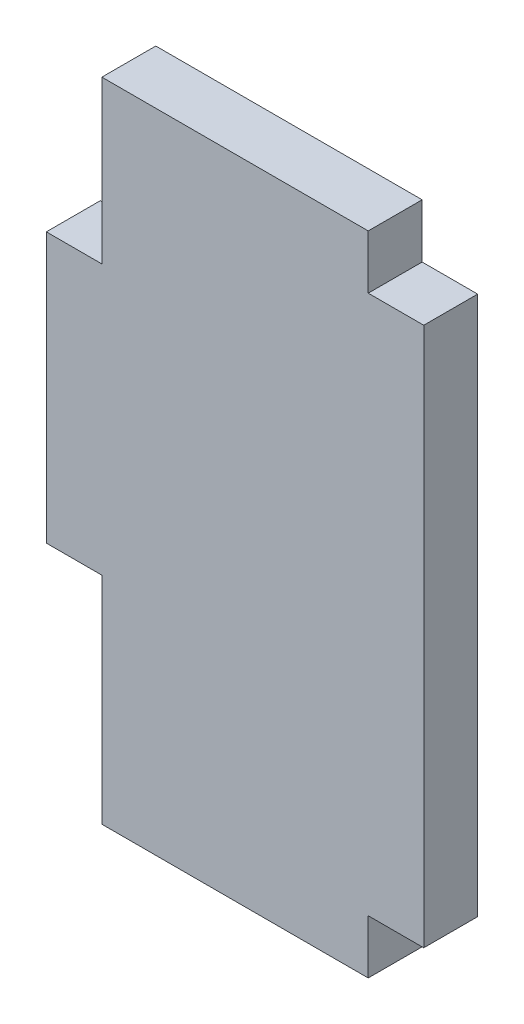
ISO-10303-21;
HEADER;
FILE_DESCRIPTION(('STEP AP214'),'2;1');
FILE_NAME('part.step','',(''),(''),'','','');
FILE_SCHEMA(('AUTOMOTIVE_DESIGN { 1 0 10303 214 1 1 1 1 }'));
ENDSEC;
DATA;
#1=APPLICATION_CONTEXT('core data for automotive mechanical design processes');
#2=APPLICATION_PROTOCOL_DEFINITION('international standard','automotive_design',2000,#1);
#3=PRODUCT_CONTEXT('',#1,'mechanical');
#4=PRODUCT('Part','Part','',(#3));
#5=PRODUCT_RELATED_PRODUCT_CATEGORY('part','',(#4));
#6=PRODUCT_DEFINITION_FORMATION('','',#4);
#7=PRODUCT_DEFINITION_CONTEXT('part definition',#1,'design');
#8=PRODUCT_DEFINITION('design','',#6,#7);
#9=PRODUCT_DEFINITION_SHAPE('','',#8);
#10=(LENGTH_UNIT() NAMED_UNIT(*) SI_UNIT(.MILLI.,.METRE.));
#11=(NAMED_UNIT(*) PLANE_ANGLE_UNIT() SI_UNIT($,.RADIAN.));
#12=(NAMED_UNIT(*) SI_UNIT($,.STERADIAN.) SOLID_ANGLE_UNIT());
#13=UNCERTAINTY_MEASURE_WITH_UNIT(LENGTH_MEASURE(1.E-05),#10,'distance_accuracy_value','');
#14=(GEOMETRIC_REPRESENTATION_CONTEXT(3) GLOBAL_UNCERTAINTY_ASSIGNED_CONTEXT((#13)) GLOBAL_UNIT_ASSIGNED_CONTEXT((#10,
#11,#12)) REPRESENTATION_CONTEXT('',''));
#15=CARTESIAN_POINT('',(0.,0.,0.));
#16=DIRECTION('',(0.,0.,1.));
#17=DIRECTION('',(1.,0.,0.));
#18=AXIS2_PLACEMENT_3D('',#15,#16,#17);
#19=CARTESIAN_POINT('',(-5.15,45.,5.));
#20=DIRECTION('',(1.,0.,0.));
#21=DIRECTION('',(0.,0.,-1.));
#22=AXIS2_PLACEMENT_3D('',#19,#20,#21);
#23=PLANE('',#22);
#24=DIRECTION('',(0.,-1.,0.));
#25=VECTOR('',#24,1.);
#26=CARTESIAN_POINT('',(-5.15,45.,0.));
#27=LINE('',#26,#25);
#28=CARTESIAN_POINT('',(-5.15,45.,0.));
#29=VERTEX_POINT('',#28);
#30=CARTESIAN_POINT('',(-5.15,20.,0.));
#31=VERTEX_POINT('',#30);
#32=EDGE_CURVE('E164',#29,#31,#27,.T.);
#33=ORIENTED_EDGE('',*,*,#32,.T.);
#34=DIRECTION('',(0.,0.,-1.));
#35=VECTOR('',#34,1.);
#36=CARTESIAN_POINT('',(-5.15,20.,5.));
#37=LINE('',#36,#35);
#38=CARTESIAN_POINT('',(-5.15,20.,5.));
#39=VERTEX_POINT('',#38);
#40=EDGE_CURVE('E11',#39,#31,#37,.T.);
#41=ORIENTED_EDGE('',*,*,#40,.F.);
#42=DIRECTION('',(0.,-1.,0.));
#43=VECTOR('',#42,1.);
#44=CARTESIAN_POINT('',(-5.15,45.,5.));
#45=LINE('',#44,#43);
#46=CARTESIAN_POINT('',(-5.15,45.,5.));
#47=VERTEX_POINT('',#46);
#48=EDGE_CURVE('E198',#47,#39,#45,.T.);
#49=ORIENTED_EDGE('',*,*,#48,.F.);
#50=DIRECTION('',(0.,0.,-1.));
#51=VECTOR('',#50,1.);
#52=CARTESIAN_POINT('',(-5.15,45.,5.));
#53=LINE('',#52,#51);
#54=EDGE_CURVE('E160',#47,#29,#53,.T.);
#55=ORIENTED_EDGE('',*,*,#54,.T.);
#56=EDGE_LOOP('',(#33,#41,#49,#55));
#57=FACE_BOUND('',#56,.T.);
#58=ADVANCED_FACE('F39',(#57),#23,.F.);
#59=CARTESIAN_POINT('',(-5.15,20.,5.));
#60=DIRECTION('',(0.,1.,0.));
#61=DIRECTION('',(0.,0.,1.));
#62=AXIS2_PLACEMENT_3D('',#59,#60,#61);
#63=PLANE('',#62);
#64=DIRECTION('',(1.,0.,0.));
#65=VECTOR('',#64,1.);
#66=CARTESIAN_POINT('',(-5.15,20.,0.));
#67=LINE('',#66,#65);
#68=CARTESIAN_POINT('',(0.,20.,0.));
#69=VERTEX_POINT('',#68);
#70=EDGE_CURVE('E168',#31,#69,#67,.T.);
#71=ORIENTED_EDGE('',*,*,#70,.T.);
#72=DIRECTION('',(0.,0.,-1.));
#73=VECTOR('',#72,1.);
#74=CARTESIAN_POINT('',(0.,20.,5.));
#75=LINE('',#74,#73);
#76=CARTESIAN_POINT('',(0.,20.,5.));
#77=VERTEX_POINT('',#76);
#78=EDGE_CURVE('E48',#77,#69,#75,.T.);
#79=ORIENTED_EDGE('',*,*,#78,.F.);
#80=DIRECTION('',(1.,0.,0.));
#81=VECTOR('',#80,1.);
#82=CARTESIAN_POINT('',(-5.15,20.,5.));
#83=LINE('',#82,#81);
#84=EDGE_CURVE('E111',#39,#77,#83,.T.);
#85=ORIENTED_EDGE('',*,*,#84,.F.);
#86=ORIENTED_EDGE('',*,*,#40,.T.);
#87=EDGE_LOOP('',(#71,#79,#85,#86));
#88=FACE_BOUND('',#87,.T.);
#89=ADVANCED_FACE('F292',(#88),#63,.F.);
#90=CARTESIAN_POINT('',(0.,20.,5.));
#91=DIRECTION('',(1.,0.,0.));
#92=DIRECTION('',(0.,0.,-1.));
#93=AXIS2_PLACEMENT_3D('',#90,#91,#92);
#94=PLANE('',#93);
#95=DIRECTION('',(0.,-1.,0.));
#96=VECTOR('',#95,1.);
#97=CARTESIAN_POINT('',(0.,20.,0.));
#98=LINE('',#97,#96);
#99=CARTESIAN_POINT('',(0.,0.,0.));
#100=VERTEX_POINT('',#99);
#101=EDGE_CURVE('E171',#69,#100,#98,.T.);
#102=ORIENTED_EDGE('',*,*,#101,.T.);
#103=DIRECTION('',(0.,0.,-1.));
#104=VECTOR('',#103,1.);
#105=CARTESIAN_POINT('',(0.,0.,5.));
#106=LINE('',#105,#104);
#107=CARTESIAN_POINT('',(0.,0.,5.));
#108=VERTEX_POINT('',#107);
#109=EDGE_CURVE('E225',#108,#100,#106,.T.);
#110=ORIENTED_EDGE('',*,*,#109,.F.);
#111=DIRECTION('',(0.,-1.,0.));
#112=VECTOR('',#111,1.);
#113=CARTESIAN_POINT('',(0.,20.,5.));
#114=LINE('',#113,#112);
#115=EDGE_CURVE('E235',#77,#108,#114,.T.);
#116=ORIENTED_EDGE('',*,*,#115,.F.);
#117=ORIENTED_EDGE('',*,*,#78,.T.);
#118=EDGE_LOOP('',(#102,#110,#116,#117));
#119=FACE_BOUND('',#118,.T.);
#120=ADVANCED_FACE('F233',(#119),#94,.F.);
#121=CARTESIAN_POINT('',(0.,0.,5.));
#122=DIRECTION('',(0.,1.,0.));
#123=DIRECTION('',(0.,0.,1.));
#124=AXIS2_PLACEMENT_3D('',#121,#122,#123);
#125=PLANE('',#124);
#126=DIRECTION('',(1.,0.,0.));
#127=VECTOR('',#126,1.);
#128=CARTESIAN_POINT('',(0.,0.,0.));
#129=LINE('',#128,#127);
#130=CARTESIAN_POINT('',(24.7,0.,0.));
#131=VERTEX_POINT('',#130);
#132=EDGE_CURVE('E174',#100,#131,#129,.T.);
#133=ORIENTED_EDGE('',*,*,#132,.T.);
#134=DIRECTION('',(0.,0.,-1.));
#135=VECTOR('',#134,1.);
#136=CARTESIAN_POINT('',(24.7,0.,5.));
#137=LINE('',#136,#135);
#138=CARTESIAN_POINT('',(24.7,0.,5.));
#139=VERTEX_POINT('',#138);
#140=EDGE_CURVE('E221',#139,#131,#137,.T.);
#141=ORIENTED_EDGE('',*,*,#140,.F.);
#142=DIRECTION('',(1.,0.,0.));
#143=VECTOR('',#142,1.);
#144=CARTESIAN_POINT('',(0.,0.,5.));
#145=LINE('',#144,#143);
#146=EDGE_CURVE('E254',#108,#139,#145,.T.);
#147=ORIENTED_EDGE('',*,*,#146,.F.);
#148=ORIENTED_EDGE('',*,*,#109,.T.);
#149=EDGE_LOOP('',(#133,#141,#147,#148));
#150=FACE_BOUND('',#149,.T.);
#151=ADVANCED_FACE('F244',(#150),#125,.F.);
#152=CARTESIAN_POINT('',(24.7,0.,5.));
#153=DIRECTION('',(-1.,0.,0.));
#154=DIRECTION('',(0.,0.,1.));
#155=AXIS2_PLACEMENT_3D('',#152,#153,#154);
#156=PLANE('',#155);
#157=DIRECTION('',(0.,1.,0.));
#158=VECTOR('',#157,1.);
#159=CARTESIAN_POINT('',(24.7,0.,0.));
#160=LINE('',#159,#158);
#161=CARTESIAN_POINT('',(24.7,5.,0.));
#162=VERTEX_POINT('',#161);
#163=EDGE_CURVE('E177',#131,#162,#160,.T.);
#164=ORIENTED_EDGE('',*,*,#163,.T.);
#165=DIRECTION('',(0.,0.,-1.));
#166=VECTOR('',#165,1.);
#167=CARTESIAN_POINT('',(24.7,5.,5.));
#168=LINE('',#167,#166);
#169=CARTESIAN_POINT('',(24.7,5.,5.));
#170=VERTEX_POINT('',#169);
#171=EDGE_CURVE('E217',#170,#162,#168,.T.);
#172=ORIENTED_EDGE('',*,*,#171,.F.);
#173=DIRECTION('',(0.,1.,0.));
#174=VECTOR('',#173,1.);
#175=CARTESIAN_POINT('',(24.7,0.,5.));
#176=LINE('',#175,#174);
#177=EDGE_CURVE('E250',#139,#170,#176,.T.);
#178=ORIENTED_EDGE('',*,*,#177,.F.);
#179=ORIENTED_EDGE('',*,*,#140,.T.);
#180=EDGE_LOOP('',(#164,#172,#178,#179));
#181=FACE_BOUND('',#180,.T.);
#182=ADVANCED_FACE('F248',(#181),#156,.F.);
#183=CARTESIAN_POINT('',(24.7,5.,5.));
#184=DIRECTION('',(0.,1.,0.));
#185=DIRECTION('',(-1.,0.,0.));
#186=AXIS2_PLACEMENT_3D('',#183,#184,#185);
#187=PLANE('',#186);
#188=DIRECTION('',(1.,0.,0.));
#189=VECTOR('',#188,1.);
#190=CARTESIAN_POINT('',(24.7,5.,0.));
#191=LINE('',#190,#189);
#192=CARTESIAN_POINT('',(29.85,5.,0.));
#193=VERTEX_POINT('',#192);
#194=EDGE_CURVE('E180',#162,#193,#191,.T.);
#195=ORIENTED_EDGE('',*,*,#194,.T.);
#196=DIRECTION('',(0.,0.,-1.));
#197=VECTOR('',#196,1.);
#198=CARTESIAN_POINT('',(29.85,5.,5.));
#199=LINE('',#198,#197);
#200=CARTESIAN_POINT('',(29.85,5.,5.));
#201=VERTEX_POINT('',#200);
#202=EDGE_CURVE('E213',#201,#193,#199,.T.);
#203=ORIENTED_EDGE('',*,*,#202,.F.);
#204=DIRECTION('',(1.,0.,0.));
#205=VECTOR('',#204,1.);
#206=CARTESIAN_POINT('',(24.7,5.,5.));
#207=LINE('',#206,#205);
#208=EDGE_CURVE('E253',#170,#201,#207,.T.);
#209=ORIENTED_EDGE('',*,*,#208,.F.);
#210=ORIENTED_EDGE('',*,*,#171,.T.);
#211=EDGE_LOOP('',(#195,#203,#209,#210));
#212=FACE_BOUND('',#211,.T.);
#213=ADVANCED_FACE('F305',(#212),#187,.F.);
#214=CARTESIAN_POINT('',(29.85,55.,5.));
#215=DIRECTION('',(-1.,0.,0.));
#216=DIRECTION('',(0.,0.,1.));
#217=AXIS2_PLACEMENT_3D('',#214,#215,#216);
#218=PLANE('',#217);
#219=DIRECTION('',(0.,1.,0.));
#220=VECTOR('',#219,1.);
#221=CARTESIAN_POINT('',(29.85,55.,0.));
#222=LINE('',#221,#220);
#223=CARTESIAN_POINT('',(29.85,55.,0.));
#224=VERTEX_POINT('',#223);
#225=EDGE_CURVE('E183',#193,#224,#222,.T.);
#226=ORIENTED_EDGE('',*,*,#225,.T.);
#227=DIRECTION('',(0.,0.,-1.));
#228=VECTOR('',#227,1.);
#229=CARTESIAN_POINT('',(29.85,55.,5.));
#230=LINE('',#229,#228);
#231=CARTESIAN_POINT('',(29.85,55.,5.));
#232=VERTEX_POINT('',#231);
#233=EDGE_CURVE('E209',#232,#224,#230,.T.);
#234=ORIENTED_EDGE('',*,*,#233,.F.);
#235=DIRECTION('',(0.,1.,0.));
#236=VECTOR('',#235,1.);
#237=CARTESIAN_POINT('',(29.85,55.,5.));
#238=LINE('',#237,#236);
#239=EDGE_CURVE('E258',#201,#232,#238,.T.);
#240=ORIENTED_EDGE('',*,*,#239,.F.);
#241=ORIENTED_EDGE('',*,*,#202,.T.);
#242=EDGE_LOOP('',(#226,#234,#240,#241));
#243=FACE_BOUND('',#242,.T.);
#244=ADVANCED_FACE('F308',(#243),#218,.F.);
#245=CARTESIAN_POINT('',(24.7,55.,5.));
#246=DIRECTION('',(0.,-1.,0.));
#247=DIRECTION('',(0.,0.,-1.));
#248=AXIS2_PLACEMENT_3D('',#245,#246,#247);
#249=PLANE('',#248);
#250=DIRECTION('',(-1.,0.,0.));
#251=VECTOR('',#250,1.);
#252=CARTESIAN_POINT('',(24.7,55.,0.));
#253=LINE('',#252,#251);
#254=CARTESIAN_POINT('',(24.7,55.,0.));
#255=VERTEX_POINT('',#254);
#256=EDGE_CURVE('E186',#224,#255,#253,.T.);
#257=ORIENTED_EDGE('',*,*,#256,.T.);
#258=DIRECTION('',(0.,0.,-1.));
#259=VECTOR('',#258,1.);
#260=CARTESIAN_POINT('',(24.7,55.,5.));
#261=LINE('',#260,#259);
#262=CARTESIAN_POINT('',(24.7,55.,5.));
#263=VERTEX_POINT('',#262);
#264=EDGE_CURVE('E205',#263,#255,#261,.T.);
#265=ORIENTED_EDGE('',*,*,#264,.F.);
#266=DIRECTION('',(-1.,0.,0.));
#267=VECTOR('',#266,1.);
#268=CARTESIAN_POINT('',(24.7,55.,5.));
#269=LINE('',#268,#267);
#270=EDGE_CURVE('E265',#232,#263,#269,.T.);
#271=ORIENTED_EDGE('',*,*,#270,.F.);
#272=ORIENTED_EDGE('',*,*,#233,.T.);
#273=EDGE_LOOP('',(#257,#265,#271,#272));
#274=FACE_BOUND('',#273,.T.);
#275=ADVANCED_FACE('F273',(#274),#249,.F.);
#276=CARTESIAN_POINT('',(24.7,60.,5.));
#277=DIRECTION('',(-1.,0.,0.));
#278=DIRECTION('',(0.,-1.,0.));
#279=AXIS2_PLACEMENT_3D('',#276,#277,#278);
#280=PLANE('',#279);
#281=DIRECTION('',(0.,1.,0.));
#282=VECTOR('',#281,1.);
#283=CARTESIAN_POINT('',(24.7,60.,0.));
#284=LINE('',#283,#282);
#285=CARTESIAN_POINT('',(24.7,60.,0.));
#286=VERTEX_POINT('',#285);
#287=EDGE_CURVE('E189',#255,#286,#284,.T.);
#288=ORIENTED_EDGE('',*,*,#287,.T.);
#289=DIRECTION('',(0.,0.,-1.));
#290=VECTOR('',#289,1.);
#291=CARTESIAN_POINT('',(24.7,60.,5.));
#292=LINE('',#291,#290);
#293=CARTESIAN_POINT('',(24.7,60.,5.));
#294=VERTEX_POINT('',#293);
#295=EDGE_CURVE('E153',#294,#286,#292,.T.);
#296=ORIENTED_EDGE('',*,*,#295,.F.);
#297=DIRECTION('',(0.,1.,0.));
#298=VECTOR('',#297,1.);
#299=CARTESIAN_POINT('',(24.7,60.,5.));
#300=LINE('',#299,#298);
#301=EDGE_CURVE('E142',#263,#294,#300,.T.);
#302=ORIENTED_EDGE('',*,*,#301,.F.);
#303=ORIENTED_EDGE('',*,*,#264,.T.);
#304=EDGE_LOOP('',(#288,#296,#302,#303));
#305=FACE_BOUND('',#304,.T.);
#306=ADVANCED_FACE('F277',(#305),#280,.F.);
#307=CARTESIAN_POINT('',(0.,60.,5.));
#308=DIRECTION('',(0.,-1.,0.));
#309=DIRECTION('',(0.,0.,-1.));
#310=AXIS2_PLACEMENT_3D('',#307,#308,#309);
#311=PLANE('',#310);
#312=DIRECTION('',(-1.,0.,0.));
#313=VECTOR('',#312,1.);
#314=CARTESIAN_POINT('',(0.,60.,0.));
#315=LINE('',#314,#313);
#316=CARTESIAN_POINT('',(0.,60.,0.));
#317=VERTEX_POINT('',#316);
#318=EDGE_CURVE('E151',#286,#317,#315,.T.);
#319=ORIENTED_EDGE('',*,*,#318,.T.);
#320=DIRECTION('',(0.,0.,-1.));
#321=VECTOR('',#320,1.);
#322=CARTESIAN_POINT('',(0.,60.,5.));
#323=LINE('',#322,#321);
#324=CARTESIAN_POINT('',(0.,60.,5.));
#325=VERTEX_POINT('',#324);
#326=EDGE_CURVE('E148',#325,#317,#323,.T.);
#327=ORIENTED_EDGE('',*,*,#326,.F.);
#328=DIRECTION('',(-1.,0.,0.));
#329=VECTOR('',#328,1.);
#330=CARTESIAN_POINT('',(0.,60.,5.));
#331=LINE('',#330,#329);
#332=EDGE_CURVE('E136',#294,#325,#331,.T.);
#333=ORIENTED_EDGE('',*,*,#332,.F.);
#334=ORIENTED_EDGE('',*,*,#295,.T.);
#335=EDGE_LOOP('',(#319,#327,#333,#334));
#336=FACE_BOUND('',#335,.T.);
#337=ADVANCED_FACE('F149',(#336),#311,.F.);
#338=CARTESIAN_POINT('',(0.,45.,5.));
#339=DIRECTION('',(1.,0.,0.));
#340=DIRECTION('',(0.,0.,-1.));
#341=AXIS2_PLACEMENT_3D('',#338,#339,#340);
#342=PLANE('',#341);
#343=DIRECTION('',(0.,-1.,0.));
#344=VECTOR('',#343,1.);
#345=CARTESIAN_POINT('',(0.,45.,0.));
#346=LINE('',#345,#344);
#347=CARTESIAN_POINT('',(0.,45.,0.));
#348=VERTEX_POINT('',#347);
#349=EDGE_CURVE('E97',#317,#348,#346,.T.);
#350=ORIENTED_EDGE('',*,*,#349,.T.);
#351=DIRECTION('',(0.,0.,-1.));
#352=VECTOR('',#351,1.);
#353=CARTESIAN_POINT('',(0.,45.,5.));
#354=LINE('',#353,#352);
#355=CARTESIAN_POINT('',(0.,45.,5.));
#356=VERTEX_POINT('',#355);
#357=EDGE_CURVE('E154',#356,#348,#354,.T.);
#358=ORIENTED_EDGE('',*,*,#357,.F.);
#359=DIRECTION('',(0.,-1.,0.));
#360=VECTOR('',#359,1.);
#361=CARTESIAN_POINT('',(0.,45.,5.));
#362=LINE('',#361,#360);
#363=EDGE_CURVE('E140',#325,#356,#362,.T.);
#364=ORIENTED_EDGE('',*,*,#363,.F.);
#365=ORIENTED_EDGE('',*,*,#326,.T.);
#366=EDGE_LOOP('',(#350,#358,#364,#365));
#367=FACE_BOUND('',#366,.T.);
#368=ADVANCED_FACE('F156',(#367),#342,.F.);
#369=CARTESIAN_POINT('',(-5.15,45.,5.));
#370=DIRECTION('',(0.,-1.,0.));
#371=DIRECTION('',(0.,0.,-1.));
#372=AXIS2_PLACEMENT_3D('',#369,#370,#371);
#373=PLANE('',#372);
#374=DIRECTION('',(-1.,0.,0.));
#375=VECTOR('',#374,1.);
#376=CARTESIAN_POINT('',(-5.15,45.,0.));
#377=LINE('',#376,#375);
#378=EDGE_CURVE('E103',#348,#29,#377,.T.);
#379=ORIENTED_EDGE('',*,*,#378,.T.);
#380=ORIENTED_EDGE('',*,*,#54,.F.);
#381=DIRECTION('',(-1.,0.,0.));
#382=VECTOR('',#381,1.);
#383=CARTESIAN_POINT('',(-5.15,45.,5.));
#384=LINE('',#383,#382);
#385=EDGE_CURVE('E56',#356,#47,#384,.T.);
#386=ORIENTED_EDGE('',*,*,#385,.F.);
#387=ORIENTED_EDGE('',*,*,#357,.T.);
#388=EDGE_LOOP('',(#379,#380,#386,#387));
#389=FACE_BOUND('',#388,.T.);
#390=ADVANCED_FACE('F281',(#389),#373,.F.);
#391=CARTESIAN_POINT('',(0.,0.,5.));
#392=DIRECTION('',(0.,0.,1.));
#393=DIRECTION('',(1.,0.,0.));
#394=AXIS2_PLACEMENT_3D('',#391,#392,#393);
#395=PLANE('',#394);
#396=ORIENTED_EDGE('',*,*,#48,.T.);
#397=ORIENTED_EDGE('',*,*,#84,.T.);
#398=ORIENTED_EDGE('',*,*,#115,.T.);
#399=ORIENTED_EDGE('',*,*,#146,.T.);
#400=ORIENTED_EDGE('',*,*,#177,.T.);
#401=ORIENTED_EDGE('',*,*,#208,.T.);
#402=ORIENTED_EDGE('',*,*,#239,.T.);
#403=ORIENTED_EDGE('',*,*,#270,.T.);
#404=ORIENTED_EDGE('',*,*,#301,.T.);
#405=ORIENTED_EDGE('',*,*,#332,.T.);
#406=ORIENTED_EDGE('',*,*,#363,.T.);
#407=ORIENTED_EDGE('',*,*,#385,.T.);
#408=EDGE_LOOP('',(#396,#397,#398,#399,#400,#401,#402,#403,#404,#405,#406,#407));
#409=FACE_BOUND('',#408,.T.);
#410=ADVANCED_FACE('F138',(#409),#395,.T.);
#411=CARTESIAN_POINT('',(0.,0.,0.));
#412=DIRECTION('',(0.,0.,1.));
#413=DIRECTION('',(1.,0.,0.));
#414=AXIS2_PLACEMENT_3D('',#411,#412,#413);
#415=PLANE('',#414);
#416=ORIENTED_EDGE('',*,*,#32,.F.);
#417=ORIENTED_EDGE('',*,*,#378,.F.);
#418=ORIENTED_EDGE('',*,*,#349,.F.);
#419=ORIENTED_EDGE('',*,*,#318,.F.);
#420=ORIENTED_EDGE('',*,*,#287,.F.);
#421=ORIENTED_EDGE('',*,*,#256,.F.);
#422=ORIENTED_EDGE('',*,*,#225,.F.);
#423=ORIENTED_EDGE('',*,*,#194,.F.);
#424=ORIENTED_EDGE('',*,*,#163,.F.);
#425=ORIENTED_EDGE('',*,*,#132,.F.);
#426=ORIENTED_EDGE('',*,*,#101,.F.);
#427=ORIENTED_EDGE('',*,*,#70,.F.);
#428=EDGE_LOOP('',(#416,#417,#418,#419,#420,#421,#422,#423,#424,#425,#426,#427));
#429=FACE_BOUND('',#428,.T.);
#430=ADVANCED_FACE('F239',(#429),#415,.F.);
#431=CLOSED_SHELL('',(#58,#89,#120,#151,#182,#213,#244,#275,#306,#337,#368,#390,#410,#430));
#432=MANIFOLD_SOLID_BREP('B2',#431);
#433=ADVANCED_BREP_SHAPE_REPRESENTATION('',(#18,#432),#14);
#434=SHAPE_DEFINITION_REPRESENTATION(#9,#433);
ENDSEC;
END-ISO-10303-21;
